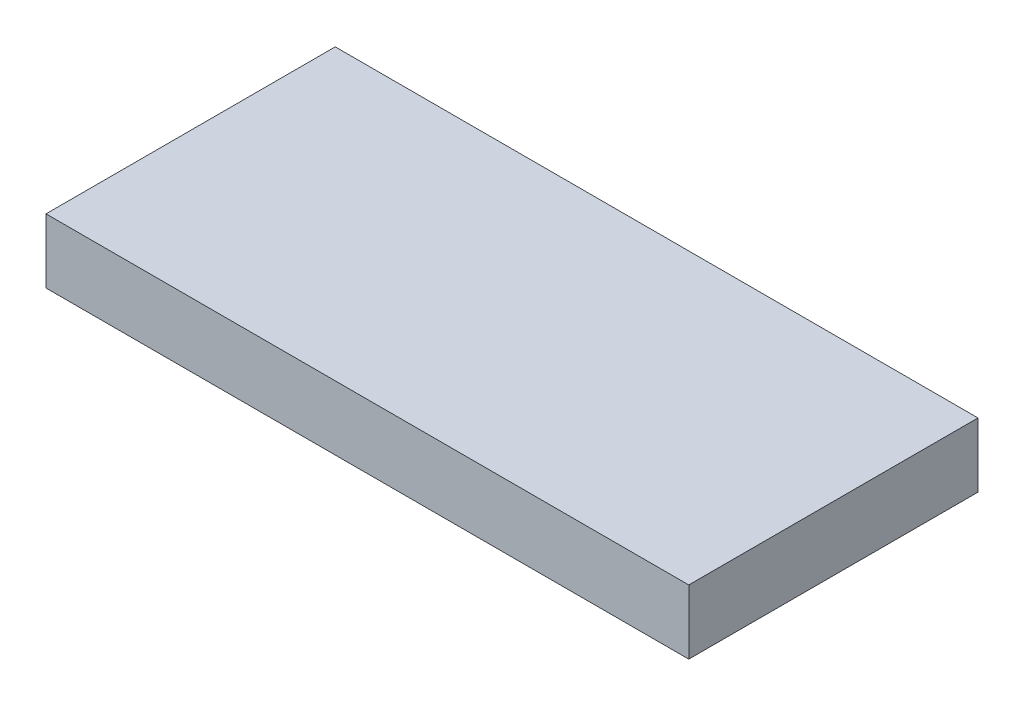
ISO-10303-21;
HEADER;
FILE_DESCRIPTION(('STEP AP214'),'2;1');
FILE_NAME('part.step','',(''),(''),'','','');
FILE_SCHEMA(('AUTOMOTIVE_DESIGN { 1 0 10303 214 1 1 1 1 }'));
ENDSEC;
DATA;
#1=APPLICATION_CONTEXT('core data for automotive mechanical design processes');
#2=APPLICATION_PROTOCOL_DEFINITION('international standard','automotive_design',2000,#1);
#3=PRODUCT_CONTEXT('',#1,'mechanical');
#4=PRODUCT('Part','Part','',(#3));
#5=PRODUCT_RELATED_PRODUCT_CATEGORY('part','',(#4));
#6=PRODUCT_DEFINITION_FORMATION('','',#4);
#7=PRODUCT_DEFINITION_CONTEXT('part definition',#1,'design');
#8=PRODUCT_DEFINITION('design','',#6,#7);
#9=PRODUCT_DEFINITION_SHAPE('','',#8);
#10=(LENGTH_UNIT() NAMED_UNIT(*) SI_UNIT(.MILLI.,.METRE.));
#11=(NAMED_UNIT(*) PLANE_ANGLE_UNIT() SI_UNIT($,.RADIAN.));
#12=(NAMED_UNIT(*) SI_UNIT($,.STERADIAN.) SOLID_ANGLE_UNIT());
#13=UNCERTAINTY_MEASURE_WITH_UNIT(LENGTH_MEASURE(1.E-05),#10,'distance_accuracy_value','');
#14=(GEOMETRIC_REPRESENTATION_CONTEXT(3) GLOBAL_UNCERTAINTY_ASSIGNED_CONTEXT((#13)) GLOBAL_UNIT_ASSIGNED_CONTEXT((#10,
#11,#12)) REPRESENTATION_CONTEXT('',''));
#15=CARTESIAN_POINT('',(0.,0.,0.));
#16=DIRECTION('',(0.,0.,1.));
#17=DIRECTION('',(1.,0.,0.));
#18=AXIS2_PLACEMENT_3D('',#15,#16,#17);
#19=CARTESIAN_POINT('',(0.,5.08,0.));
#20=DIRECTION('',(1.,0.,0.));
#21=DIRECTION('',(0.,0.,-1.));
#22=AXIS2_PLACEMENT_3D('',#19,#20,#21);
#23=PLANE('',#22);
#24=DIRECTION('',(0.,0.,1.));
#25=VECTOR('',#24,1.);
#26=CARTESIAN_POINT('',(0.,0.,0.));
#27=LINE('',#26,#25);
#28=CARTESIAN_POINT('',(0.,0.,-22.86));
#29=VERTEX_POINT('',#28);
#30=CARTESIAN_POINT('',(0.,0.,0.));
#31=VERTEX_POINT('',#30);
#32=EDGE_CURVE('E96',#29,#31,#27,.T.);
#33=ORIENTED_EDGE('',*,*,#32,.T.);
#34=DIRECTION('',(0.,-1.,0.));
#35=VECTOR('',#34,1.);
#36=CARTESIAN_POINT('',(0.,5.08,0.));
#37=LINE('',#36,#35);
#38=CARTESIAN_POINT('',(0.,5.08,0.));
#39=VERTEX_POINT('',#38);
#40=EDGE_CURVE('E11',#39,#31,#37,.T.);
#41=ORIENTED_EDGE('',*,*,#40,.F.);
#42=DIRECTION('',(0.,0.,1.));
#43=VECTOR('',#42,1.);
#44=CARTESIAN_POINT('',(0.,5.08,0.));
#45=LINE('',#44,#43);
#46=CARTESIAN_POINT('',(0.,5.08,-22.86));
#47=VERTEX_POINT('',#46);
#48=EDGE_CURVE('E84',#47,#39,#45,.T.);
#49=ORIENTED_EDGE('',*,*,#48,.F.);
#50=DIRECTION('',(0.,-1.,0.));
#51=VECTOR('',#50,1.);
#52=CARTESIAN_POINT('',(0.,5.08,-22.86));
#53=LINE('',#52,#51);
#54=EDGE_CURVE('E92',#47,#29,#53,.T.);
#55=ORIENTED_EDGE('',*,*,#54,.T.);
#56=EDGE_LOOP('',(#33,#41,#49,#55));
#57=FACE_BOUND('',#56,.T.);
#58=ADVANCED_FACE('F33',(#57),#23,.F.);
#59=CARTESIAN_POINT('',(0.,5.08,0.));
#60=DIRECTION('',(0.,0.,-1.));
#61=DIRECTION('',(-1.,0.,0.));
#62=AXIS2_PLACEMENT_3D('',#59,#60,#61);
#63=PLANE('',#62);
#64=DIRECTION('',(1.,0.,0.));
#65=VECTOR('',#64,1.);
#66=CARTESIAN_POINT('',(0.,0.,0.));
#67=LINE('',#66,#65);
#68=CARTESIAN_POINT('',(50.8,0.,0.));
#69=VERTEX_POINT('',#68);
#70=EDGE_CURVE('E88',#31,#69,#67,.T.);
#71=ORIENTED_EDGE('',*,*,#70,.T.);
#72=DIRECTION('',(0.,-1.,0.));
#73=VECTOR('',#72,1.);
#74=CARTESIAN_POINT('',(50.8,5.08,0.));
#75=LINE('',#74,#73);
#76=CARTESIAN_POINT('',(50.8,5.08,0.));
#77=VERTEX_POINT('',#76);
#78=EDGE_CURVE('E41',#77,#69,#75,.T.);
#79=ORIENTED_EDGE('',*,*,#78,.F.);
#80=DIRECTION('',(1.,0.,0.));
#81=VECTOR('',#80,1.);
#82=CARTESIAN_POINT('',(0.,5.08,0.));
#83=LINE('',#82,#81);
#84=EDGE_CURVE('E79',#39,#77,#83,.T.);
#85=ORIENTED_EDGE('',*,*,#84,.F.);
#86=ORIENTED_EDGE('',*,*,#40,.T.);
#87=EDGE_LOOP('',(#71,#79,#85,#86));
#88=FACE_BOUND('',#87,.T.);
#89=ADVANCED_FACE('F87',(#88),#63,.F.);
#90=CARTESIAN_POINT('',(50.8,5.08,0.));
#91=DIRECTION('',(-1.,0.,0.));
#92=DIRECTION('',(0.,0.,1.));
#93=AXIS2_PLACEMENT_3D('',#90,#91,#92);
#94=PLANE('',#93);
#95=DIRECTION('',(0.,0.,-1.));
#96=VECTOR('',#95,1.);
#97=CARTESIAN_POINT('',(50.8,0.,0.));
#98=LINE('',#97,#96);
#99=CARTESIAN_POINT('',(50.8,0.,-22.86));
#100=VERTEX_POINT('',#99);
#101=EDGE_CURVE('E66',#69,#100,#98,.T.);
#102=ORIENTED_EDGE('',*,*,#101,.T.);
#103=DIRECTION('',(0.,-1.,0.));
#104=VECTOR('',#103,1.);
#105=CARTESIAN_POINT('',(50.8,5.08,-22.86));
#106=LINE('',#105,#104);
#107=CARTESIAN_POINT('',(50.8,5.08,-22.86));
#108=VERTEX_POINT('',#107);
#109=EDGE_CURVE('E89',#108,#100,#106,.T.);
#110=ORIENTED_EDGE('',*,*,#109,.F.);
#111=DIRECTION('',(0.,0.,-1.));
#112=VECTOR('',#111,1.);
#113=CARTESIAN_POINT('',(50.8,5.08,0.));
#114=LINE('',#113,#112);
#115=EDGE_CURVE('E82',#77,#108,#114,.T.);
#116=ORIENTED_EDGE('',*,*,#115,.F.);
#117=ORIENTED_EDGE('',*,*,#78,.T.);
#118=EDGE_LOOP('',(#102,#110,#116,#117));
#119=FACE_BOUND('',#118,.T.);
#120=ADVANCED_FACE('F90',(#119),#94,.F.);
#121=CARTESIAN_POINT('',(0.,5.08,-22.86));
#122=DIRECTION('',(0.,0.,1.));
#123=DIRECTION('',(1.,0.,0.));
#124=AXIS2_PLACEMENT_3D('',#121,#122,#123);
#125=PLANE('',#124);
#126=DIRECTION('',(-1.,0.,0.));
#127=VECTOR('',#126,1.);
#128=CARTESIAN_POINT('',(0.,0.,-22.86));
#129=LINE('',#128,#127);
#130=EDGE_CURVE('E72',#100,#29,#129,.T.);
#131=ORIENTED_EDGE('',*,*,#130,.T.);
#132=ORIENTED_EDGE('',*,*,#54,.F.);
#133=DIRECTION('',(-1.,0.,0.));
#134=VECTOR('',#133,1.);
#135=CARTESIAN_POINT('',(0.,5.08,-22.86));
#136=LINE('',#135,#134);
#137=EDGE_CURVE('E49',#108,#47,#136,.T.);
#138=ORIENTED_EDGE('',*,*,#137,.F.);
#139=ORIENTED_EDGE('',*,*,#109,.T.);
#140=EDGE_LOOP('',(#131,#132,#138,#139));
#141=FACE_BOUND('',#140,.T.);
#142=ADVANCED_FACE('F103',(#141),#125,.F.);
#143=CARTESIAN_POINT('',(0.,5.08,0.));
#144=DIRECTION('',(0.,-1.,0.));
#145=DIRECTION('',(0.,0.,-1.));
#146=AXIS2_PLACEMENT_3D('',#143,#144,#145);
#147=PLANE('',#146);
#148=ORIENTED_EDGE('',*,*,#48,.T.);
#149=ORIENTED_EDGE('',*,*,#84,.T.);
#150=ORIENTED_EDGE('',*,*,#115,.T.);
#151=ORIENTED_EDGE('',*,*,#137,.T.);
#152=EDGE_LOOP('',(#148,#149,#150,#151));
#153=FACE_BOUND('',#152,.T.);
#154=ADVANCED_FACE('F80',(#153),#147,.F.);
#155=CARTESIAN_POINT('',(0.,0.,0.));
#156=DIRECTION('',(0.,-1.,0.));
#157=DIRECTION('',(0.,0.,-1.));
#158=AXIS2_PLACEMENT_3D('',#155,#156,#157);
#159=PLANE('',#158);
#160=ORIENTED_EDGE('',*,*,#32,.F.);
#161=ORIENTED_EDGE('',*,*,#130,.F.);
#162=ORIENTED_EDGE('',*,*,#101,.F.);
#163=ORIENTED_EDGE('',*,*,#70,.F.);
#164=EDGE_LOOP('',(#160,#161,#162,#163));
#165=FACE_BOUND('',#164,.T.);
#166=ADVANCED_FACE('F106',(#165),#159,.T.);
#167=CLOSED_SHELL('',(#58,#89,#120,#142,#154,#166));
#168=MANIFOLD_SOLID_BREP('B2',#167);
#169=ADVANCED_BREP_SHAPE_REPRESENTATION('',(#18,#168),#14);
#170=SHAPE_DEFINITION_REPRESENTATION(#9,#169);
ENDSEC;
END-ISO-10303-21;
